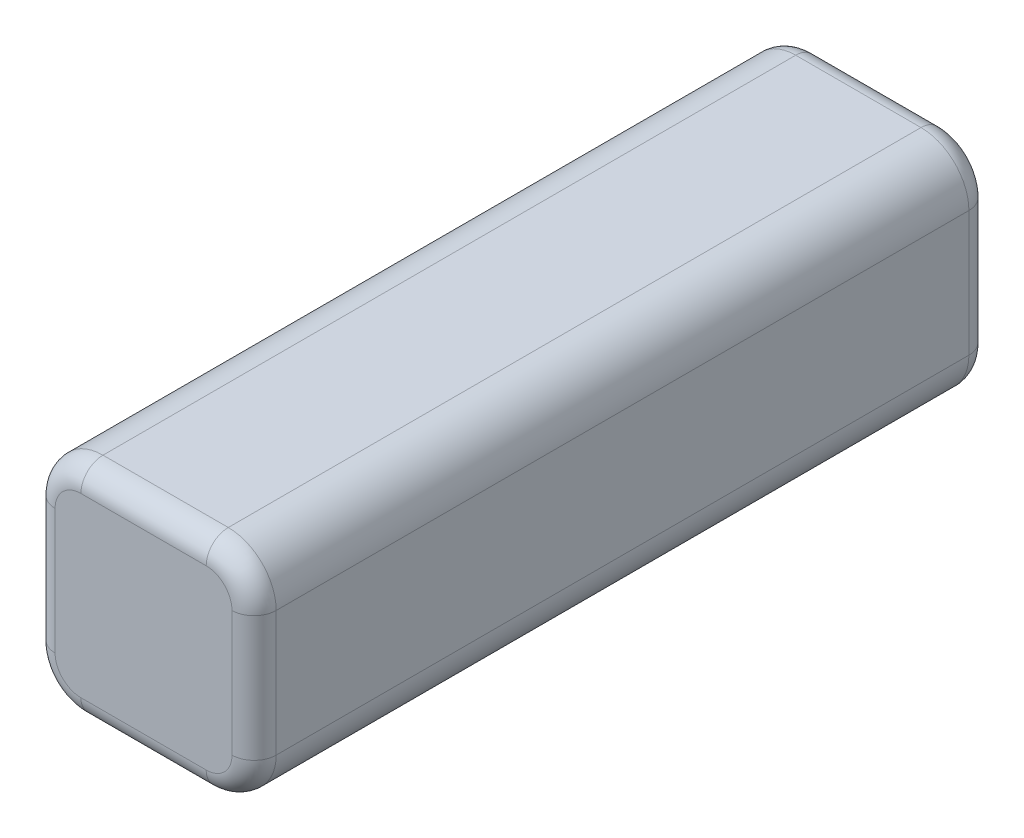
ISO-10303-21;
HEADER;
FILE_DESCRIPTION(('STEP AP214'),'2;1');
FILE_NAME('part.step','',(''),(''),'','','');
FILE_SCHEMA(('AUTOMOTIVE_DESIGN { 1 0 10303 214 1 1 1 1 }'));
ENDSEC;
DATA;
#1=APPLICATION_CONTEXT('core data for automotive mechanical design processes');
#2=APPLICATION_PROTOCOL_DEFINITION('international standard','automotive_design',2000,#1);
#3=PRODUCT_CONTEXT('',#1,'mechanical');
#4=PRODUCT('Part','Part','',(#3));
#5=PRODUCT_RELATED_PRODUCT_CATEGORY('part','',(#4));
#6=PRODUCT_DEFINITION_FORMATION('','',#4);
#7=PRODUCT_DEFINITION_CONTEXT('part definition',#1,'design');
#8=PRODUCT_DEFINITION('design','',#6,#7);
#9=PRODUCT_DEFINITION_SHAPE('','',#8);
#10=(LENGTH_UNIT() NAMED_UNIT(*) SI_UNIT(.MILLI.,.METRE.));
#11=(NAMED_UNIT(*) PLANE_ANGLE_UNIT() SI_UNIT($,.RADIAN.));
#12=(NAMED_UNIT(*) SI_UNIT($,.STERADIAN.) SOLID_ANGLE_UNIT());
#13=UNCERTAINTY_MEASURE_WITH_UNIT(LENGTH_MEASURE(1.E-05),#10,'distance_accuracy_value','');
#14=(GEOMETRIC_REPRESENTATION_CONTEXT(3) GLOBAL_UNCERTAINTY_ASSIGNED_CONTEXT((#13)) GLOBAL_UNIT_ASSIGNED_CONTEXT((#10,
#11,#12)) REPRESENTATION_CONTEXT('',''));
#15=CARTESIAN_POINT('',(0.,0.,0.));
#16=DIRECTION('',(0.,0.,1.));
#17=DIRECTION('',(1.,0.,0.));
#18=AXIS2_PLACEMENT_3D('',#15,#16,#17);
#19=CARTESIAN_POINT('',(-0.850000000000004,0.85,10.));
#20=DIRECTION('',(0.,0.,-1.));
#21=DIRECTION('',(-1.,0.,0.));
#22=AXIS2_PLACEMENT_3D('',#19,#20,#21);
#23=CYLINDRICAL_SURFACE('',#22,0.649999999999997);
#24=DIRECTION('',(0.,0.,-1.));
#25=VECTOR('',#24,1.);
#26=CARTESIAN_POINT('',(-0.849999999999998,1.5,10.));
#27=LINE('',#26,#25);
#28=CARTESIAN_POINT('',(-0.849999999999998,1.5,9.7));
#29=VERTEX_POINT('',#28);
#30=CARTESIAN_POINT('',(-0.849999999999998,1.5,0.3));
#31=VERTEX_POINT('',#30);
#32=EDGE_CURVE('E264',#29,#31,#27,.T.);
#33=ORIENTED_EDGE('',*,*,#32,.T.);
#34=CARTESIAN_POINT('',(-0.850000000000004,0.85,0.3));
#35=DIRECTION('',(0.,0.,-1.));
#36=DIRECTION('',(-1.,0.,0.));
#37=AXIS2_PLACEMENT_3D('',#34,#35,#36);
#38=CIRCLE('',#37,0.649999999999997);
#39=CARTESIAN_POINT('',(-1.5,0.849999999999996,0.3));
#40=VERTEX_POINT('',#39);
#41=EDGE_CURVE('E229',#31,#40,#38,.F.);
#42=ORIENTED_EDGE('',*,*,#41,.T.);
#43=DIRECTION('',(0.,0.,-1.));
#44=VECTOR('',#43,1.);
#45=CARTESIAN_POINT('',(-1.5,0.849999999999996,10.));
#46=LINE('',#45,#44);
#47=CARTESIAN_POINT('',(-1.5,0.849999999999996,9.7));
#48=VERTEX_POINT('',#47);
#49=EDGE_CURVE('E168',#48,#40,#46,.T.);
#50=ORIENTED_EDGE('',*,*,#49,.F.);
#51=CARTESIAN_POINT('',(-0.850000000000004,0.85,9.7));
#52=DIRECTION('',(0.,0.,-1.));
#53=DIRECTION('',(-1.,0.,0.));
#54=AXIS2_PLACEMENT_3D('',#51,#52,#53);
#55=CIRCLE('',#54,0.649999999999997);
#56=EDGE_CURVE('E227',#48,#29,#55,.T.);
#57=ORIENTED_EDGE('',*,*,#56,.T.);
#58=EDGE_LOOP('',(#33,#42,#50,#57));
#59=FACE_BOUND('',#58,.T.);
#60=ADVANCED_FACE('F32',(#59),#23,.T.);
#61=CARTESIAN_POINT('',(-1.5,-0.849999999999995,10.));
#62=DIRECTION('',(1.,0.,0.));
#63=DIRECTION('',(0.,0.,-1.));
#64=AXIS2_PLACEMENT_3D('',#61,#62,#63);
#65=PLANE('',#64);
#66=ORIENTED_EDGE('',*,*,#49,.T.);
#67=DIRECTION('',(0.,-1.,0.));
#68=VECTOR('',#67,1.);
#69=CARTESIAN_POINT('',(-1.5,-0.849999999999995,0.3));
#70=LINE('',#69,#68);
#71=CARTESIAN_POINT('',(-1.5,-0.849999999999995,0.3));
#72=VERTEX_POINT('',#71);
#73=EDGE_CURVE('E167',#40,#72,#70,.T.);
#74=ORIENTED_EDGE('',*,*,#73,.T.);
#75=DIRECTION('',(0.,0.,-1.));
#76=VECTOR('',#75,1.);
#77=CARTESIAN_POINT('',(-1.5,-0.849999999999995,10.));
#78=LINE('',#77,#76);
#79=CARTESIAN_POINT('',(-1.5,-0.849999999999995,9.7));
#80=VERTEX_POINT('',#79);
#81=EDGE_CURVE('E149',#80,#72,#78,.T.);
#82=ORIENTED_EDGE('',*,*,#81,.F.);
#83=DIRECTION('',(0.,-1.,0.));
#84=VECTOR('',#83,1.);
#85=CARTESIAN_POINT('',(-1.5,-0.849999999999995,9.7));
#86=LINE('',#85,#84);
#87=EDGE_CURVE('E164',#80,#48,#86,.F.);
#88=ORIENTED_EDGE('',*,*,#87,.T.);
#89=EDGE_LOOP('',(#66,#74,#82,#88));
#90=FACE_BOUND('',#89,.T.);
#91=ADVANCED_FACE('F162',(#90),#65,.F.);
#92=CARTESIAN_POINT('',(-0.850000000000004,-0.85,10.));
#93=DIRECTION('',(0.,0.,-1.));
#94=DIRECTION('',(-1.,0.,0.));
#95=AXIS2_PLACEMENT_3D('',#92,#93,#94);
#96=CYLINDRICAL_SURFACE('',#95,0.649999999999998);
#97=ORIENTED_EDGE('',*,*,#81,.T.);
#98=CARTESIAN_POINT('',(-0.850000000000004,-0.85,0.3));
#99=DIRECTION('',(0.,0.,-1.));
#100=DIRECTION('',(-1.,0.,0.));
#101=AXIS2_PLACEMENT_3D('',#98,#99,#100);
#102=CIRCLE('',#101,0.649999999999998);
#103=CARTESIAN_POINT('',(-0.849999999999997,-1.5,0.3));
#104=VERTEX_POINT('',#103);
#105=EDGE_CURVE('E156',#72,#104,#102,.F.);
#106=ORIENTED_EDGE('',*,*,#105,.T.);
#107=DIRECTION('',(0.,0.,-1.));
#108=VECTOR('',#107,1.);
#109=CARTESIAN_POINT('',(-0.849999999999997,-1.5,10.));
#110=LINE('',#109,#108);
#111=CARTESIAN_POINT('',(-0.849999999999997,-1.5,9.7));
#112=VERTEX_POINT('',#111);
#113=EDGE_CURVE('E151',#112,#104,#110,.T.);
#114=ORIENTED_EDGE('',*,*,#113,.F.);
#115=CARTESIAN_POINT('',(-0.850000000000004,-0.85,9.7));
#116=DIRECTION('',(0.,0.,-1.));
#117=DIRECTION('',(-1.,0.,0.));
#118=AXIS2_PLACEMENT_3D('',#115,#116,#117);
#119=CIRCLE('',#118,0.649999999999998);
#120=EDGE_CURVE('E146',#112,#80,#119,.T.);
#121=ORIENTED_EDGE('',*,*,#120,.T.);
#122=EDGE_LOOP('',(#97,#106,#114,#121));
#123=FACE_BOUND('',#122,.T.);
#124=ADVANCED_FACE('F148',(#123),#96,.T.);
#125=CARTESIAN_POINT('',(-0.849999999999997,-1.5,10.));
#126=DIRECTION('',(0.,1.,0.));
#127=DIRECTION('',(-1.,0.,0.));
#128=AXIS2_PLACEMENT_3D('',#125,#126,#127);
#129=PLANE('',#128);
#130=ORIENTED_EDGE('',*,*,#113,.T.);
#131=DIRECTION('',(1.,0.,0.));
#132=VECTOR('',#131,1.);
#133=CARTESIAN_POINT('',(0.849999999999991,-1.5,0.3));
#134=LINE('',#133,#132);
#135=CARTESIAN_POINT('',(0.849999999999991,-1.5,0.3));
#136=VERTEX_POINT('',#135);
#137=EDGE_CURVE('E208',#104,#136,#134,.T.);
#138=ORIENTED_EDGE('',*,*,#137,.T.);
#139=DIRECTION('',(0.,0.,-1.));
#140=VECTOR('',#139,1.);
#141=CARTESIAN_POINT('',(0.849999999999991,-1.5,10.));
#142=LINE('',#141,#140);
#143=CARTESIAN_POINT('',(0.849999999999991,-1.5,9.7));
#144=VERTEX_POINT('',#143);
#145=EDGE_CURVE('E289',#144,#136,#142,.T.);
#146=ORIENTED_EDGE('',*,*,#145,.F.);
#147=DIRECTION('',(1.,0.,0.));
#148=VECTOR('',#147,1.);
#149=CARTESIAN_POINT('',(-0.849999999999997,-1.5,9.7));
#150=LINE('',#149,#148);
#151=EDGE_CURVE('E206',#144,#112,#150,.F.);
#152=ORIENTED_EDGE('',*,*,#151,.T.);
#153=EDGE_LOOP('',(#130,#138,#146,#152));
#154=FACE_BOUND('',#153,.T.);
#155=ADVANCED_FACE('F286',(#154),#129,.F.);
#156=CARTESIAN_POINT('',(0.849999999999997,-0.85,10.));
#157=DIRECTION('',(0.,0.,-1.));
#158=DIRECTION('',(-1.,0.,0.));
#159=AXIS2_PLACEMENT_3D('',#156,#157,#158);
#160=CYLINDRICAL_SURFACE('',#159,0.650000000000001);
#161=ORIENTED_EDGE('',*,*,#145,.T.);
#162=CARTESIAN_POINT('',(0.849999999999997,-0.85,0.3));
#163=DIRECTION('',(0.,0.,-1.));
#164=DIRECTION('',(-1.,0.,0.));
#165=AXIS2_PLACEMENT_3D('',#162,#163,#164);
#166=CIRCLE('',#165,0.650000000000001);
#167=CARTESIAN_POINT('',(1.5,-0.85,0.3));
#168=VERTEX_POINT('',#167);
#169=EDGE_CURVE('E212',#136,#168,#166,.F.);
#170=ORIENTED_EDGE('',*,*,#169,.T.);
#171=DIRECTION('',(0.,0.,-1.));
#172=VECTOR('',#171,1.);
#173=CARTESIAN_POINT('',(1.5,-0.85,10.));
#174=LINE('',#173,#172);
#175=CARTESIAN_POINT('',(1.5,-0.85,9.7));
#176=VERTEX_POINT('',#175);
#177=EDGE_CURVE('E292',#176,#168,#174,.T.);
#178=ORIENTED_EDGE('',*,*,#177,.F.);
#179=CARTESIAN_POINT('',(0.849999999999997,-0.85,9.7));
#180=DIRECTION('',(0.,0.,-1.));
#181=DIRECTION('',(-1.,0.,0.));
#182=AXIS2_PLACEMENT_3D('',#179,#180,#181);
#183=CIRCLE('',#182,0.650000000000001);
#184=EDGE_CURVE('E210',#176,#144,#183,.T.);
#185=ORIENTED_EDGE('',*,*,#184,.T.);
#186=EDGE_LOOP('',(#161,#170,#178,#185));
#187=FACE_BOUND('',#186,.T.);
#188=ADVANCED_FACE('F337',(#187),#160,.T.);
#189=CARTESIAN_POINT('',(1.5,-0.849999999999993,10.));
#190=DIRECTION('',(-1.,0.,0.));
#191=DIRECTION('',(0.,-1.,0.));
#192=AXIS2_PLACEMENT_3D('',#189,#190,#191);
#193=PLANE('',#192);
#194=ORIENTED_EDGE('',*,*,#177,.T.);
#195=DIRECTION('',(0.,1.,0.));
#196=VECTOR('',#195,1.);
#197=CARTESIAN_POINT('',(1.5,0.849999999999996,0.3));
#198=LINE('',#197,#196);
#199=CARTESIAN_POINT('',(1.5,0.849999999999996,0.3));
#200=VERTEX_POINT('',#199);
#201=EDGE_CURVE('E216',#168,#200,#198,.T.);
#202=ORIENTED_EDGE('',*,*,#201,.T.);
#203=DIRECTION('',(0.,0.,-1.));
#204=VECTOR('',#203,1.);
#205=CARTESIAN_POINT('',(1.5,0.849999999999996,10.));
#206=LINE('',#205,#204);
#207=CARTESIAN_POINT('',(1.5,0.849999999999996,9.7));
#208=VERTEX_POINT('',#207);
#209=EDGE_CURVE('E296',#208,#200,#206,.T.);
#210=ORIENTED_EDGE('',*,*,#209,.F.);
#211=DIRECTION('',(0.,1.,0.));
#212=VECTOR('',#211,1.);
#213=CARTESIAN_POINT('',(1.5,-0.849999999999993,9.7));
#214=LINE('',#213,#212);
#215=EDGE_CURVE('E214',#208,#176,#214,.F.);
#216=ORIENTED_EDGE('',*,*,#215,.T.);
#217=EDGE_LOOP('',(#194,#202,#210,#216));
#218=FACE_BOUND('',#217,.T.);
#219=ADVANCED_FACE('F340',(#218),#193,.F.);
#220=CARTESIAN_POINT('',(0.849999999999997,0.85,10.));
#221=DIRECTION('',(0.,0.,-1.));
#222=DIRECTION('',(-1.,0.,0.));
#223=AXIS2_PLACEMENT_3D('',#220,#221,#222);
#224=CYLINDRICAL_SURFACE('',#223,0.65);
#225=ORIENTED_EDGE('',*,*,#209,.T.);
#226=CARTESIAN_POINT('',(0.849999999999997,0.85,0.3));
#227=DIRECTION('',(0.,0.,-1.));
#228=DIRECTION('',(-1.,0.,0.));
#229=AXIS2_PLACEMENT_3D('',#226,#227,#228);
#230=CIRCLE('',#229,0.65);
#231=CARTESIAN_POINT('',(0.84999999999999,1.5,0.3));
#232=VERTEX_POINT('',#231);
#233=EDGE_CURVE('E220',#200,#232,#230,.F.);
#234=ORIENTED_EDGE('',*,*,#233,.T.);
#235=DIRECTION('',(0.,0.,-1.));
#236=VECTOR('',#235,1.);
#237=CARTESIAN_POINT('',(0.84999999999999,1.5,10.));
#238=LINE('',#237,#236);
#239=CARTESIAN_POINT('',(0.84999999999999,1.5,9.7));
#240=VERTEX_POINT('',#239);
#241=EDGE_CURVE('E301',#240,#232,#238,.T.);
#242=ORIENTED_EDGE('',*,*,#241,.F.);
#243=CARTESIAN_POINT('',(0.849999999999997,0.85,9.7));
#244=DIRECTION('',(0.,0.,-1.));
#245=DIRECTION('',(-1.,0.,0.));
#246=AXIS2_PLACEMENT_3D('',#243,#244,#245);
#247=CIRCLE('',#246,0.65);
#248=EDGE_CURVE('E218',#240,#208,#247,.T.);
#249=ORIENTED_EDGE('',*,*,#248,.T.);
#250=EDGE_LOOP('',(#225,#234,#242,#249));
#251=FACE_BOUND('',#250,.T.);
#252=ADVANCED_FACE('F354',(#251),#224,.T.);
#253=CARTESIAN_POINT('',(-0.849999999999998,1.5,10.));
#254=DIRECTION('',(0.,-1.,0.));
#255=DIRECTION('',(1.,0.,0.));
#256=AXIS2_PLACEMENT_3D('',#253,#254,#255);
#257=PLANE('',#256);
#258=ORIENTED_EDGE('',*,*,#241,.T.);
#259=DIRECTION('',(-1.,0.,0.));
#260=VECTOR('',#259,1.);
#261=CARTESIAN_POINT('',(-0.849999999999998,1.5,0.3));
#262=LINE('',#261,#260);
#263=EDGE_CURVE('E225',#232,#31,#262,.T.);
#264=ORIENTED_EDGE('',*,*,#263,.T.);
#265=ORIENTED_EDGE('',*,*,#32,.F.);
#266=DIRECTION('',(-1.,0.,0.));
#267=VECTOR('',#266,1.);
#268=CARTESIAN_POINT('',(-0.849999999999998,1.5,9.7));
#269=LINE('',#268,#267);
#270=EDGE_CURVE('E222',#29,#240,#269,.F.);
#271=ORIENTED_EDGE('',*,*,#270,.T.);
#272=EDGE_LOOP('',(#258,#264,#265,#271));
#273=FACE_BOUND('',#272,.T.);
#274=ADVANCED_FACE('F355',(#273),#257,.F.);
#275=CARTESIAN_POINT('',(-0.850000000000004,0.85,10.));
#276=DIRECTION('',(0.,0.,-1.));
#277=DIRECTION('',(-1.,0.,0.));
#278=AXIS2_PLACEMENT_3D('',#275,#276,#277);
#279=PLANE('',#278);
#280=CARTESIAN_POINT('',(0.849999999999997,0.85,10.));
#281=DIRECTION('',(0.,0.,-1.));
#282=DIRECTION('',(-1.,0.,0.));
#283=AXIS2_PLACEMENT_3D('',#280,#281,#282);
#284=CIRCLE('',#283,0.35);
#285=CARTESIAN_POINT('',(1.2,0.849999999999998,10.));
#286=VERTEX_POINT('',#285);
#287=CARTESIAN_POINT('',(0.84999999999999,1.2,10.));
#288=VERTEX_POINT('',#287);
#289=EDGE_CURVE('E41',#286,#288,#284,.F.);
#290=ORIENTED_EDGE('',*,*,#289,.T.);
#291=DIRECTION('',(-1.,0.,0.));
#292=VECTOR('',#291,1.);
#293=CARTESIAN_POINT('',(-0.850000000000004,1.2,10.));
#294=LINE('',#293,#292);
#295=CARTESIAN_POINT('',(-0.849999999999998,1.2,10.));
#296=VERTEX_POINT('',#295);
#297=EDGE_CURVE('E11',#288,#296,#294,.T.);
#298=ORIENTED_EDGE('',*,*,#297,.T.);
#299=CARTESIAN_POINT('',(-0.850000000000004,0.85,10.));
#300=DIRECTION('',(0.,0.,-1.));
#301=DIRECTION('',(-1.,0.,0.));
#302=AXIS2_PLACEMENT_3D('',#299,#300,#301);
#303=CIRCLE('',#302,0.349999999999997);
#304=CARTESIAN_POINT('',(-1.2,0.849999999999996,10.));
#305=VERTEX_POINT('',#304);
#306=EDGE_CURVE('E231',#296,#305,#303,.F.);
#307=ORIENTED_EDGE('',*,*,#306,.T.);
#308=DIRECTION('',(0.,-1.,0.));
#309=VECTOR('',#308,1.);
#310=CARTESIAN_POINT('',(-1.2,0.85,10.));
#311=LINE('',#310,#309);
#312=CARTESIAN_POINT('',(-1.2,-0.849999999999997,10.));
#313=VERTEX_POINT('',#312);
#314=EDGE_CURVE('E233',#305,#313,#311,.T.);
#315=ORIENTED_EDGE('',*,*,#314,.T.);
#316=CARTESIAN_POINT('',(-0.850000000000004,-0.85,10.));
#317=DIRECTION('',(0.,0.,-1.));
#318=DIRECTION('',(-1.,0.,0.));
#319=AXIS2_PLACEMENT_3D('',#316,#317,#318);
#320=CIRCLE('',#319,0.349999999999998);
#321=CARTESIAN_POINT('',(-0.849999999999996,-1.2,10.));
#322=VERTEX_POINT('',#321);
#323=EDGE_CURVE('E174',#313,#322,#320,.F.);
#324=ORIENTED_EDGE('',*,*,#323,.T.);
#325=DIRECTION('',(1.,0.,0.));
#326=VECTOR('',#325,1.);
#327=CARTESIAN_POINT('',(-0.850000000000006,-1.2,10.));
#328=LINE('',#327,#326);
#329=CARTESIAN_POINT('',(0.849999999999993,-1.2,10.));
#330=VERTEX_POINT('',#329);
#331=EDGE_CURVE('E236',#322,#330,#328,.T.);
#332=ORIENTED_EDGE('',*,*,#331,.T.);
#333=CARTESIAN_POINT('',(0.849999999999997,-0.85,10.));
#334=DIRECTION('',(0.,0.,-1.));
#335=DIRECTION('',(-1.,0.,0.));
#336=AXIS2_PLACEMENT_3D('',#333,#334,#335);
#337=CIRCLE('',#336,0.350000000000001);
#338=CARTESIAN_POINT('',(1.2,-0.85,10.));
#339=VERTEX_POINT('',#338);
#340=EDGE_CURVE('E238',#330,#339,#337,.F.);
#341=ORIENTED_EDGE('',*,*,#340,.T.);
#342=DIRECTION('',(0.,1.,0.));
#343=VECTOR('',#342,1.);
#344=CARTESIAN_POINT('',(1.2,0.850000000000002,10.));
#345=LINE('',#344,#343);
#346=EDGE_CURVE('E52',#339,#286,#345,.T.);
#347=ORIENTED_EDGE('',*,*,#346,.T.);
#348=EDGE_LOOP('',(#290,#298,#307,#315,#324,#332,#341,#347));
#349=FACE_BOUND('',#348,.T.);
#350=ADVANCED_FACE('F364',(#349),#279,.F.);
#351=CARTESIAN_POINT('',(-0.850000000000004,0.85,0.));
#352=DIRECTION('',(0.,0.,-1.));
#353=DIRECTION('',(-1.,0.,0.));
#354=AXIS2_PLACEMENT_3D('',#351,#352,#353);
#355=PLANE('',#354);
#356=CARTESIAN_POINT('',(-0.850000000000004,-0.85,0.));
#357=DIRECTION('',(0.,0.,-1.));
#358=DIRECTION('',(-1.,0.,0.));
#359=AXIS2_PLACEMENT_3D('',#356,#357,#358);
#360=CIRCLE('',#359,0.349999999999998);
#361=CARTESIAN_POINT('',(-0.85,-1.2,0.));
#362=VERTEX_POINT('',#361);
#363=CARTESIAN_POINT('',(-1.2,-0.849999999999995,0.));
#364=VERTEX_POINT('',#363);
#365=EDGE_CURVE('E201',#362,#364,#360,.T.);
#366=ORIENTED_EDGE('',*,*,#365,.T.);
#367=DIRECTION('',(0.,-1.,0.));
#368=VECTOR('',#367,1.);
#369=CARTESIAN_POINT('',(-1.2,0.849999999999996,0.));
#370=LINE('',#369,#368);
#371=CARTESIAN_POINT('',(-1.2,0.849999999999996,0.));
#372=VERTEX_POINT('',#371);
#373=EDGE_CURVE('E157',#364,#372,#370,.F.);
#374=ORIENTED_EDGE('',*,*,#373,.T.);
#375=CARTESIAN_POINT('',(-0.850000000000004,0.85,0.));
#376=DIRECTION('',(0.,0.,-1.));
#377=DIRECTION('',(-1.,0.,0.));
#378=AXIS2_PLACEMENT_3D('',#375,#376,#377);
#379=CIRCLE('',#378,0.349999999999997);
#380=CARTESIAN_POINT('',(-0.849999999999998,1.2,0.));
#381=VERTEX_POINT('',#380);
#382=EDGE_CURVE('E186',#372,#381,#379,.T.);
#383=ORIENTED_EDGE('',*,*,#382,.T.);
#384=DIRECTION('',(-1.,0.,0.));
#385=VECTOR('',#384,1.);
#386=CARTESIAN_POINT('',(0.84999999999999,1.2,0.));
#387=LINE('',#386,#385);
#388=CARTESIAN_POINT('',(0.849999999999993,1.2,0.));
#389=VERTEX_POINT('',#388);
#390=EDGE_CURVE('E191',#381,#389,#387,.F.);
#391=ORIENTED_EDGE('',*,*,#390,.T.);
#392=CARTESIAN_POINT('',(0.849999999999997,0.85,0.));
#393=DIRECTION('',(0.,0.,-1.));
#394=DIRECTION('',(-1.,0.,0.));
#395=AXIS2_PLACEMENT_3D('',#392,#393,#394);
#396=CIRCLE('',#395,0.35);
#397=CARTESIAN_POINT('',(1.2,0.849999999999996,0.));
#398=VERTEX_POINT('',#397);
#399=EDGE_CURVE('E193',#389,#398,#396,.T.);
#400=ORIENTED_EDGE('',*,*,#399,.T.);
#401=DIRECTION('',(0.,1.,0.));
#402=VECTOR('',#401,1.);
#403=CARTESIAN_POINT('',(1.2,-0.85,0.));
#404=LINE('',#403,#402);
#405=CARTESIAN_POINT('',(1.2,-0.85,0.));
#406=VERTEX_POINT('',#405);
#407=EDGE_CURVE('E195',#398,#406,#404,.F.);
#408=ORIENTED_EDGE('',*,*,#407,.T.);
#409=CARTESIAN_POINT('',(0.849999999999997,-0.85,0.));
#410=DIRECTION('',(0.,0.,-1.));
#411=DIRECTION('',(-1.,0.,0.));
#412=AXIS2_PLACEMENT_3D('',#409,#410,#411);
#413=CIRCLE('',#412,0.350000000000001);
#414=CARTESIAN_POINT('',(0.849999999999991,-1.2,0.));
#415=VERTEX_POINT('',#414);
#416=EDGE_CURVE('E197',#406,#415,#413,.T.);
#417=ORIENTED_EDGE('',*,*,#416,.T.);
#418=DIRECTION('',(1.,0.,0.));
#419=VECTOR('',#418,1.);
#420=CARTESIAN_POINT('',(-0.849999999999996,-1.2,0.));
#421=LINE('',#420,#419);
#422=EDGE_CURVE('E199',#415,#362,#421,.F.);
#423=ORIENTED_EDGE('',*,*,#422,.T.);
#424=EDGE_LOOP('',(#366,#374,#383,#391,#400,#408,#417,#423));
#425=FACE_BOUND('',#424,.T.);
#426=ADVANCED_FACE('F366',(#425),#355,.T.);
#427=CARTESIAN_POINT('',(1.2,-0.849999999999993,0.3));
#428=DIRECTION('',(0.,-1.,0.));
#429=DIRECTION('',(1.,0.,0.));
#430=AXIS2_PLACEMENT_3D('',#427,#428,#429);
#431=CYLINDRICAL_SURFACE('',#430,0.3);
#432=CARTESIAN_POINT('',(1.2,-0.85,0.3));
#433=DIRECTION('',(0.,-1.,0.));
#434=DIRECTION('',(0.,0.,-1.));
#435=AXIS2_PLACEMENT_3D('',#432,#433,#434);
#436=CIRCLE('',#435,0.3);
#437=EDGE_CURVE('E258',#406,#168,#436,.T.);
#438=ORIENTED_EDGE('',*,*,#437,.F.);
#439=ORIENTED_EDGE('',*,*,#407,.F.);
#440=CARTESIAN_POINT('',(1.2,0.849999999999996,0.3));
#441=DIRECTION('',(0.,1.,0.));
#442=DIRECTION('',(-1.,0.,0.));
#443=AXIS2_PLACEMENT_3D('',#440,#441,#442);
#444=CIRCLE('',#443,0.3);
#445=EDGE_CURVE('E261',#200,#398,#444,.T.);
#446=ORIENTED_EDGE('',*,*,#445,.F.);
#447=ORIENTED_EDGE('',*,*,#201,.F.);
#448=EDGE_LOOP('',(#438,#439,#446,#447));
#449=FACE_BOUND('',#448,.T.);
#450=ADVANCED_FACE('F345',(#449),#431,.T.);
#451=CARTESIAN_POINT('',(0.849999999999997,0.85,0.3));
#452=DIRECTION('',(0.,0.,-1.));
#453=DIRECTION('',(-1.,0.,0.));
#454=AXIS2_PLACEMENT_3D('',#451,#452,#453);
#455=TOROIDAL_SURFACE('',#454,0.35,0.3);
#456=ORIENTED_EDGE('',*,*,#445,.T.);
#457=ORIENTED_EDGE('',*,*,#399,.F.);
#458=CARTESIAN_POINT('',(0.849999999999993,1.2,0.3));
#459=DIRECTION('',(-1.,0.,0.));
#460=DIRECTION('',(0.,-1.,0.));
#461=AXIS2_PLACEMENT_3D('',#458,#459,#460);
#462=CIRCLE('',#461,0.3);
#463=EDGE_CURVE('E255',#232,#389,#462,.T.);
#464=ORIENTED_EDGE('',*,*,#463,.F.);
#465=ORIENTED_EDGE('',*,*,#233,.F.);
#466=EDGE_LOOP('',(#456,#457,#464,#465));
#467=FACE_BOUND('',#466,.T.);
#468=ADVANCED_FACE('F351',(#467),#455,.T.);
#469=CARTESIAN_POINT('',(0.849999999999997,-0.85,0.3));
#470=DIRECTION('',(0.,0.,-1.));
#471=DIRECTION('',(-1.,0.,0.));
#472=AXIS2_PLACEMENT_3D('',#469,#470,#471);
#473=TOROIDAL_SURFACE('',#472,0.350000000000001,0.3);
#474=ORIENTED_EDGE('',*,*,#437,.T.);
#475=ORIENTED_EDGE('',*,*,#169,.F.);
#476=CARTESIAN_POINT('',(0.849999999999991,-1.2,0.3));
#477=DIRECTION('',(-1.,0.,0.));
#478=DIRECTION('',(0.,-1.,0.));
#479=AXIS2_PLACEMENT_3D('',#476,#477,#478);
#480=CIRCLE('',#479,0.3);
#481=EDGE_CURVE('E252',#415,#136,#480,.T.);
#482=ORIENTED_EDGE('',*,*,#481,.F.);
#483=ORIENTED_EDGE('',*,*,#416,.F.);
#484=EDGE_LOOP('',(#474,#475,#482,#483));
#485=FACE_BOUND('',#484,.T.);
#486=ADVANCED_FACE('F334',(#485),#473,.T.);
#487=CARTESIAN_POINT('',(-0.849999999999998,1.2,0.3));
#488=DIRECTION('',(1.,0.,0.));
#489=DIRECTION('',(0.,1.,0.));
#490=AXIS2_PLACEMENT_3D('',#487,#488,#489);
#491=CYLINDRICAL_SURFACE('',#490,0.3);
#492=ORIENTED_EDGE('',*,*,#463,.T.);
#493=ORIENTED_EDGE('',*,*,#390,.F.);
#494=CARTESIAN_POINT('',(-0.849999999999998,1.2,0.3));
#495=DIRECTION('',(-1.,0.,0.));
#496=DIRECTION('',(0.,-1.,0.));
#497=AXIS2_PLACEMENT_3D('',#494,#495,#496);
#498=CIRCLE('',#497,0.3);
#499=EDGE_CURVE('E249',#31,#381,#498,.T.);
#500=ORIENTED_EDGE('',*,*,#499,.F.);
#501=ORIENTED_EDGE('',*,*,#263,.F.);
#502=EDGE_LOOP('',(#492,#493,#500,#501));
#503=FACE_BOUND('',#502,.T.);
#504=ADVANCED_FACE('F314',(#503),#491,.T.);
#505=CARTESIAN_POINT('',(-0.849999999999996,-1.2,0.3));
#506=DIRECTION('',(-1.,0.,0.));
#507=DIRECTION('',(0.,-1.,0.));
#508=AXIS2_PLACEMENT_3D('',#505,#506,#507);
#509=CYLINDRICAL_SURFACE('',#508,0.3);
#510=ORIENTED_EDGE('',*,*,#481,.T.);
#511=ORIENTED_EDGE('',*,*,#137,.F.);
#512=CARTESIAN_POINT('',(-0.85,-1.2,0.3));
#513=DIRECTION('',(-1.,0.,0.));
#514=DIRECTION('',(0.,-1.,0.));
#515=AXIS2_PLACEMENT_3D('',#512,#513,#514);
#516=CIRCLE('',#515,0.3);
#517=EDGE_CURVE('E246',#362,#104,#516,.T.);
#518=ORIENTED_EDGE('',*,*,#517,.F.);
#519=ORIENTED_EDGE('',*,*,#422,.F.);
#520=EDGE_LOOP('',(#510,#511,#518,#519));
#521=FACE_BOUND('',#520,.T.);
#522=ADVANCED_FACE('F330',(#521),#509,.T.);
#523=CARTESIAN_POINT('',(-0.850000000000004,0.85,0.3));
#524=DIRECTION('',(0.,0.,-1.));
#525=DIRECTION('',(-1.,0.,0.));
#526=AXIS2_PLACEMENT_3D('',#523,#524,#525);
#527=TOROIDAL_SURFACE('',#526,0.349999999999997,0.3);
#528=ORIENTED_EDGE('',*,*,#499,.T.);
#529=ORIENTED_EDGE('',*,*,#382,.F.);
#530=CARTESIAN_POINT('',(-1.2,0.849999999999998,0.3));
#531=DIRECTION('',(0.,-1.,0.));
#532=DIRECTION('',(0.,0.,-1.));
#533=AXIS2_PLACEMENT_3D('',#530,#531,#532);
#534=CIRCLE('',#533,0.3);
#535=EDGE_CURVE('E244',#40,#372,#534,.T.);
#536=ORIENTED_EDGE('',*,*,#535,.F.);
#537=ORIENTED_EDGE('',*,*,#41,.F.);
#538=EDGE_LOOP('',(#528,#529,#536,#537));
#539=FACE_BOUND('',#538,.T.);
#540=ADVANCED_FACE('F318',(#539),#527,.T.);
#541=CARTESIAN_POINT('',(-0.850000000000004,-0.85,0.3));
#542=DIRECTION('',(0.,0.,-1.));
#543=DIRECTION('',(-1.,0.,0.));
#544=AXIS2_PLACEMENT_3D('',#541,#542,#543);
#545=TOROIDAL_SURFACE('',#544,0.349999999999998,0.3);
#546=ORIENTED_EDGE('',*,*,#517,.T.);
#547=ORIENTED_EDGE('',*,*,#105,.F.);
#548=CARTESIAN_POINT('',(-1.2,-0.849999999999995,0.3));
#549=DIRECTION('',(0.,1.,0.));
#550=DIRECTION('',(0.,0.,1.));
#551=AXIS2_PLACEMENT_3D('',#548,#549,#550);
#552=CIRCLE('',#551,0.3);
#553=EDGE_CURVE('E242',#364,#72,#552,.T.);
#554=ORIENTED_EDGE('',*,*,#553,.F.);
#555=ORIENTED_EDGE('',*,*,#365,.F.);
#556=EDGE_LOOP('',(#546,#547,#554,#555));
#557=FACE_BOUND('',#556,.T.);
#558=ADVANCED_FACE('F326',(#557),#545,.T.);
#559=CARTESIAN_POINT('',(-1.2,-0.849999999999995,0.3));
#560=DIRECTION('',(0.,1.,0.));
#561=DIRECTION('',(0.,0.,1.));
#562=AXIS2_PLACEMENT_3D('',#559,#560,#561);
#563=CYLINDRICAL_SURFACE('',#562,0.3);
#564=ORIENTED_EDGE('',*,*,#535,.T.);
#565=ORIENTED_EDGE('',*,*,#373,.F.);
#566=ORIENTED_EDGE('',*,*,#553,.T.);
#567=ORIENTED_EDGE('',*,*,#73,.F.);
#568=EDGE_LOOP('',(#564,#565,#566,#567));
#569=FACE_BOUND('',#568,.T.);
#570=ADVANCED_FACE('F321',(#569),#563,.T.);
#571=CARTESIAN_POINT('',(-0.850000000000006,-1.2,9.7));
#572=DIRECTION('',(1.,0.,0.));
#573=DIRECTION('',(0.,1.,0.));
#574=AXIS2_PLACEMENT_3D('',#571,#572,#573);
#575=CYLINDRICAL_SURFACE('',#574,0.3);
#576=CARTESIAN_POINT('',(-0.849999999999996,-1.2,9.7));
#577=DIRECTION('',(-1.,0.,0.));
#578=DIRECTION('',(0.,-1.,0.));
#579=AXIS2_PLACEMENT_3D('',#576,#577,#578);
#580=CIRCLE('',#579,0.3);
#581=EDGE_CURVE('E273',#112,#322,#580,.T.);
#582=ORIENTED_EDGE('',*,*,#581,.F.);
#583=ORIENTED_EDGE('',*,*,#151,.F.);
#584=CARTESIAN_POINT('',(0.849999999999993,-1.2,9.7));
#585=DIRECTION('',(1.,0.,0.));
#586=DIRECTION('',(0.,1.,0.));
#587=AXIS2_PLACEMENT_3D('',#584,#585,#586);
#588=CIRCLE('',#587,0.3);
#589=EDGE_CURVE('E36',#330,#144,#588,.T.);
#590=ORIENTED_EDGE('',*,*,#589,.F.);
#591=ORIENTED_EDGE('',*,*,#331,.F.);
#592=EDGE_LOOP('',(#582,#583,#590,#591));
#593=FACE_BOUND('',#592,.T.);
#594=ADVANCED_FACE('F34',(#593),#575,.T.);
#595=CARTESIAN_POINT('',(0.849999999999997,-0.85,9.7));
#596=DIRECTION('',(0.,0.,-1.));
#597=DIRECTION('',(-1.,0.,0.));
#598=AXIS2_PLACEMENT_3D('',#595,#596,#597);
#599=TOROIDAL_SURFACE('',#598,0.350000000000001,0.3);
#600=ORIENTED_EDGE('',*,*,#589,.T.);
#601=ORIENTED_EDGE('',*,*,#184,.F.);
#602=CARTESIAN_POINT('',(1.2,-0.85,9.7));
#603=DIRECTION('',(0.,1.,0.));
#604=DIRECTION('',(-1.,0.,0.));
#605=AXIS2_PLACEMENT_3D('',#602,#603,#604);
#606=CIRCLE('',#605,0.3);
#607=EDGE_CURVE('E177',#339,#176,#606,.T.);
#608=ORIENTED_EDGE('',*,*,#607,.F.);
#609=ORIENTED_EDGE('',*,*,#340,.F.);
#610=EDGE_LOOP('',(#600,#601,#608,#609));
#611=FACE_BOUND('',#610,.T.);
#612=ADVANCED_FACE('F279',(#611),#599,.T.);
#613=CARTESIAN_POINT('',(-0.850000000000004,-0.85,9.7));
#614=DIRECTION('',(0.,0.,-1.));
#615=DIRECTION('',(-1.,0.,0.));
#616=AXIS2_PLACEMENT_3D('',#613,#614,#615);
#617=TOROIDAL_SURFACE('',#616,0.349999999999998,0.3);
#618=ORIENTED_EDGE('',*,*,#581,.T.);
#619=ORIENTED_EDGE('',*,*,#323,.F.);
#620=CARTESIAN_POINT('',(-1.2,-0.849999999999997,9.7));
#621=DIRECTION('',(0.,1.,0.));
#622=DIRECTION('',(-1.,0.,0.));
#623=AXIS2_PLACEMENT_3D('',#620,#621,#622);
#624=CIRCLE('',#623,0.3);
#625=EDGE_CURVE('E172',#80,#313,#624,.T.);
#626=ORIENTED_EDGE('',*,*,#625,.F.);
#627=ORIENTED_EDGE('',*,*,#120,.F.);
#628=EDGE_LOOP('',(#618,#619,#626,#627));
#629=FACE_BOUND('',#628,.T.);
#630=ADVANCED_FACE('F173',(#629),#617,.T.);
#631=CARTESIAN_POINT('',(1.2,0.850000000000002,9.7));
#632=DIRECTION('',(0.,1.,0.));
#633=DIRECTION('',(-1.,0.,0.));
#634=AXIS2_PLACEMENT_3D('',#631,#632,#633);
#635=CYLINDRICAL_SURFACE('',#634,0.3);
#636=ORIENTED_EDGE('',*,*,#607,.T.);
#637=ORIENTED_EDGE('',*,*,#215,.F.);
#638=CARTESIAN_POINT('',(1.2,0.849999999999998,9.7));
#639=DIRECTION('',(0.,1.,0.));
#640=DIRECTION('',(-1.,0.,0.));
#641=AXIS2_PLACEMENT_3D('',#638,#639,#640);
#642=CIRCLE('',#641,0.3);
#643=EDGE_CURVE('E178',#286,#208,#642,.T.);
#644=ORIENTED_EDGE('',*,*,#643,.F.);
#645=ORIENTED_EDGE('',*,*,#346,.F.);
#646=EDGE_LOOP('',(#636,#637,#644,#645));
#647=FACE_BOUND('',#646,.T.);
#648=ADVANCED_FACE('F409',(#647),#635,.T.);
#649=CARTESIAN_POINT('',(-1.2,0.85,9.7));
#650=DIRECTION('',(0.,-1.,0.));
#651=DIRECTION('',(0.,0.,-1.));
#652=AXIS2_PLACEMENT_3D('',#649,#650,#651);
#653=CYLINDRICAL_SURFACE('',#652,0.3);
#654=ORIENTED_EDGE('',*,*,#625,.T.);
#655=ORIENTED_EDGE('',*,*,#314,.F.);
#656=CARTESIAN_POINT('',(-1.2,0.849999999999996,9.7));
#657=DIRECTION('',(0.,1.,0.));
#658=DIRECTION('',(0.,0.,1.));
#659=AXIS2_PLACEMENT_3D('',#656,#657,#658);
#660=CIRCLE('',#659,0.3);
#661=EDGE_CURVE('E183',#48,#305,#660,.T.);
#662=ORIENTED_EDGE('',*,*,#661,.F.);
#663=ORIENTED_EDGE('',*,*,#87,.F.);
#664=EDGE_LOOP('',(#654,#655,#662,#663));
#665=FACE_BOUND('',#664,.T.);
#666=ADVANCED_FACE('F181',(#665),#653,.T.);
#667=CARTESIAN_POINT('',(0.849999999999997,0.85,9.7));
#668=DIRECTION('',(0.,0.,-1.));
#669=DIRECTION('',(-1.,0.,0.));
#670=AXIS2_PLACEMENT_3D('',#667,#668,#669);
#671=TOROIDAL_SURFACE('',#670,0.35,0.3);
#672=ORIENTED_EDGE('',*,*,#643,.T.);
#673=ORIENTED_EDGE('',*,*,#248,.F.);
#674=CARTESIAN_POINT('',(0.84999999999999,1.2,9.7));
#675=DIRECTION('',(-1.,0.,0.));
#676=DIRECTION('',(0.,-1.,0.));
#677=AXIS2_PLACEMENT_3D('',#674,#675,#676);
#678=CIRCLE('',#677,0.3);
#679=EDGE_CURVE('E267',#288,#240,#678,.T.);
#680=ORIENTED_EDGE('',*,*,#679,.F.);
#681=ORIENTED_EDGE('',*,*,#289,.F.);
#682=EDGE_LOOP('',(#672,#673,#680,#681));
#683=FACE_BOUND('',#682,.T.);
#684=ADVANCED_FACE('F403',(#683),#671,.T.);
#685=CARTESIAN_POINT('',(-0.850000000000004,0.85,9.7));
#686=DIRECTION('',(0.,0.,-1.));
#687=DIRECTION('',(-1.,0.,0.));
#688=AXIS2_PLACEMENT_3D('',#685,#686,#687);
#689=TOROIDAL_SURFACE('',#688,0.349999999999997,0.3);
#690=ORIENTED_EDGE('',*,*,#661,.T.);
#691=ORIENTED_EDGE('',*,*,#306,.F.);
#692=CARTESIAN_POINT('',(-0.850000000000001,1.2,9.7));
#693=DIRECTION('',(1.,0.,0.));
#694=DIRECTION('',(0.,0.,-1.));
#695=AXIS2_PLACEMENT_3D('',#692,#693,#694);
#696=CIRCLE('',#695,0.3);
#697=EDGE_CURVE('E265',#29,#296,#696,.T.);
#698=ORIENTED_EDGE('',*,*,#697,.F.);
#699=ORIENTED_EDGE('',*,*,#56,.F.);
#700=EDGE_LOOP('',(#690,#691,#698,#699));
#701=FACE_BOUND('',#700,.T.);
#702=ADVANCED_FACE('F363',(#701),#689,.T.);
#703=CARTESIAN_POINT('',(-0.850000000000004,1.2,9.7));
#704=DIRECTION('',(-1.,0.,0.));
#705=DIRECTION('',(0.,-1.,0.));
#706=AXIS2_PLACEMENT_3D('',#703,#704,#705);
#707=CYLINDRICAL_SURFACE('',#706,0.3);
#708=ORIENTED_EDGE('',*,*,#679,.T.);
#709=ORIENTED_EDGE('',*,*,#270,.F.);
#710=ORIENTED_EDGE('',*,*,#697,.T.);
#711=ORIENTED_EDGE('',*,*,#297,.F.);
#712=EDGE_LOOP('',(#708,#709,#710,#711));
#713=FACE_BOUND('',#712,.T.);
#714=ADVANCED_FACE('F358',(#713),#707,.T.);
#715=CLOSED_SHELL('',(#60,#91,#124,#155,#188,#219,#252,#274,#350,#426,#450,#468,#486,#504,#522,
#540,#558,#570,#594,#612,#630,#648,#666,#684,#702,#714));
#716=MANIFOLD_SOLID_BREP('B2',#715);
#717=ADVANCED_BREP_SHAPE_REPRESENTATION('',(#18,#716),#14);
#718=SHAPE_DEFINITION_REPRESENTATION(#9,#717);
ENDSEC;
END-ISO-10303-21;
